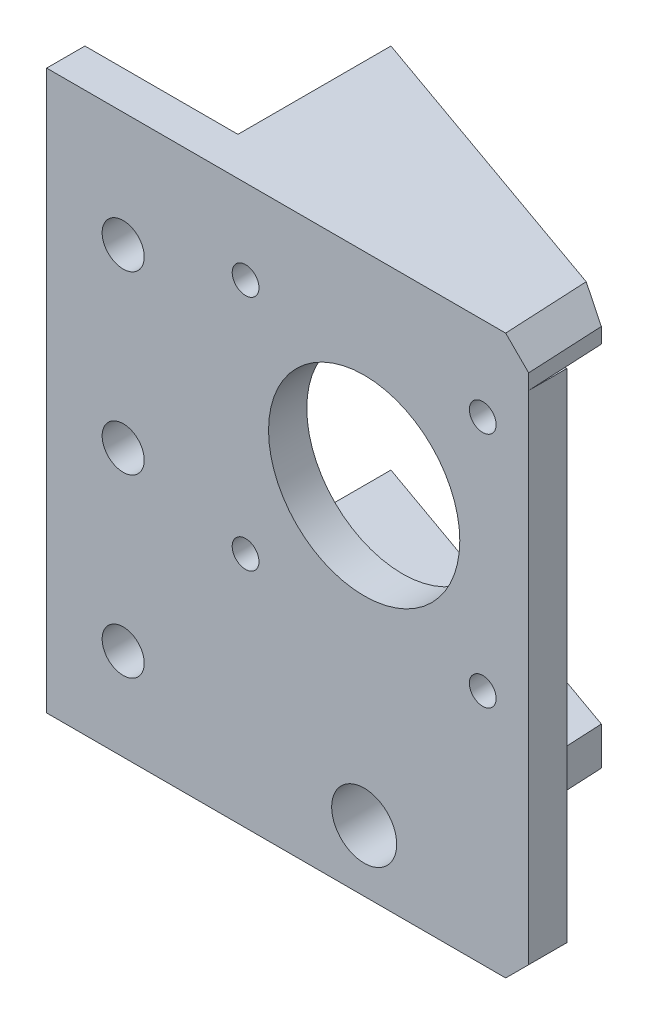
ISO-10303-21;
HEADER;
FILE_DESCRIPTION(('STEP AP214'),'2;1');
FILE_NAME('part.step','',(''),(''),'','','');
FILE_SCHEMA(('AUTOMOTIVE_DESIGN { 1 0 10303 214 1 1 1 1 }'));
ENDSEC;
DATA;
#1=APPLICATION_CONTEXT('core data for automotive mechanical design processes');
#2=APPLICATION_PROTOCOL_DEFINITION('international standard','automotive_design',2000,#1);
#3=PRODUCT_CONTEXT('',#1,'mechanical');
#4=PRODUCT('Part','Part','',(#3));
#5=PRODUCT_RELATED_PRODUCT_CATEGORY('part','',(#4));
#6=PRODUCT_DEFINITION_FORMATION('','',#4);
#7=PRODUCT_DEFINITION_CONTEXT('part definition',#1,'design');
#8=PRODUCT_DEFINITION('design','',#6,#7);
#9=PRODUCT_DEFINITION_SHAPE('','',#8);
#10=(LENGTH_UNIT() NAMED_UNIT(*) SI_UNIT(.MILLI.,.METRE.));
#11=(NAMED_UNIT(*) PLANE_ANGLE_UNIT() SI_UNIT($,.RADIAN.));
#12=(NAMED_UNIT(*) SI_UNIT($,.STERADIAN.) SOLID_ANGLE_UNIT());
#13=UNCERTAINTY_MEASURE_WITH_UNIT(LENGTH_MEASURE(1.E-05),#10,'distance_accuracy_value','');
#14=(GEOMETRIC_REPRESENTATION_CONTEXT(3) GLOBAL_UNCERTAINTY_ASSIGNED_CONTEXT((#13)) GLOBAL_UNIT_ASSIGNED_CONTEXT((#10,
#11,#12)) REPRESENTATION_CONTEXT('',''));
#15=CARTESIAN_POINT('',(0.,0.,0.));
#16=DIRECTION('',(0.,0.,1.));
#17=DIRECTION('',(1.,0.,0.));
#18=AXIS2_PLACEMENT_3D('',#15,#16,#17);
#19=CARTESIAN_POINT('',(63.027972027972,16.9685314685315,-20.));
#20=DIRECTION('',(1.,0.,0.));
#21=DIRECTION('',(0.,0.,1.));
#22=AXIS2_PLACEMENT_3D('',#19,#20,#21);
#23=PLANE('',#22);
#24=DIRECTION('',(0.,-1.,0.));
#25=VECTOR('',#24,1.);
#26=CARTESIAN_POINT('',(63.027972027972,16.9685314685315,0.));
#27=LINE('',#26,#25);
#28=CARTESIAN_POINT('',(63.027972027972,16.9685314685315,0.));
#29=VERTEX_POINT('',#28);
#30=CARTESIAN_POINT('',(63.027972027972,11.9685314685315,0.));
#31=VERTEX_POINT('',#30);
#32=EDGE_CURVE('E147',#29,#31,#27,.T.);
#33=ORIENTED_EDGE('',*,*,#32,.F.);
#34=DIRECTION('',(0.,0.,-1.));
#35=VECTOR('',#34,1.);
#36=CARTESIAN_POINT('',(63.027972027972,16.9685314685315,-20.));
#37=LINE('',#36,#35);
#38=CARTESIAN_POINT('',(63.027972027972,16.9685314685315,-20.));
#39=VERTEX_POINT('',#38);
#40=EDGE_CURVE('E165',#29,#39,#37,.T.);
#41=ORIENTED_EDGE('',*,*,#40,.T.);
#42=DIRECTION('',(0.,-1.,0.));
#43=VECTOR('',#42,1.);
#44=CARTESIAN_POINT('',(63.027972027972,16.9685314685315,-20.));
#45=LINE('',#44,#43);
#46=CARTESIAN_POINT('',(63.027972027972,11.9685314685315,-20.));
#47=VERTEX_POINT('',#46);
#48=EDGE_CURVE('E189',#39,#47,#45,.T.);
#49=ORIENTED_EDGE('',*,*,#48,.T.);
#50=DIRECTION('',(0.,0.,-1.));
#51=VECTOR('',#50,1.);
#52=CARTESIAN_POINT('',(63.027972027972,11.9685314685315,-20.));
#53=LINE('',#52,#51);
#54=EDGE_CURVE('E181',#31,#47,#53,.T.);
#55=ORIENTED_EDGE('',*,*,#54,.F.);
#56=EDGE_LOOP('',(#33,#41,#49,#55));
#57=FACE_BOUND('',#56,.T.);
#58=ADVANCED_FACE('F38',(#57),#23,.F.);
#59=CARTESIAN_POINT('',(106.027972027972,11.9685314685315,5.));
#60=DIRECTION('',(0.,-1.,0.));
#61=DIRECTION('',(0.,0.,-1.));
#62=AXIS2_PLACEMENT_3D('',#59,#60,#61);
#63=PLANE('',#62);
#64=DIRECTION('',(0.0499376169439517,0.,0.998752338877842));
#65=VECTOR('',#64,1.);
#66=CARTESIAN_POINT('',(106.027972027972,11.9685314685315,5.));
#67=LINE('',#66,#65);
#68=CARTESIAN_POINT('',(105.777972027972,11.9685314685315,0.));
#69=VERTEX_POINT('',#68);
#70=CARTESIAN_POINT('',(106.027972027972,11.9685314685315,5.));
#71=VERTEX_POINT('',#70);
#72=EDGE_CURVE('E173',#69,#71,#67,.T.);
#73=ORIENTED_EDGE('',*,*,#72,.T.);
#74=DIRECTION('',(0.,0.,-1.));
#75=VECTOR('',#74,1.);
#76=CARTESIAN_POINT('',(106.027972027972,11.9685314685315,5.));
#77=LINE('',#76,#75);
#78=CARTESIAN_POINT('',(106.027972027972,11.9685314685315,0.));
#79=VERTEX_POINT('',#78);
#80=EDGE_CURVE('E156',#71,#79,#77,.T.);
#81=ORIENTED_EDGE('',*,*,#80,.T.);
#82=DIRECTION('',(1.,0.,0.));
#83=VECTOR('',#82,1.);
#84=CARTESIAN_POINT('',(106.027972027972,11.9685314685315,0.));
#85=LINE('',#84,#83);
#86=EDGE_CURVE('E256',#69,#79,#85,.T.);
#87=ORIENTED_EDGE('',*,*,#86,.F.);
#88=EDGE_LOOP('',(#73,#81,#87));
#89=FACE_BOUND('',#88,.T.);
#90=ADVANCED_FACE('F287',(#89),#63,.F.);
#91=CARTESIAN_POINT('',(86.0559440559441,0.,0.));
#92=DIRECTION('',(0.,0.,1.));
#93=DIRECTION('',(-1.,0.,0.));
#94=AXIS2_PLACEMENT_3D('',#91,#92,#93);
#95=PLANE('',#94);
#96=CARTESIAN_POINT('',(53.027972027972,-44.0314685314685,0.));
#97=DIRECTION('',(0.,0.,-1.));
#98=DIRECTION('',(-1.,0.,0.));
#99=AXIS2_PLACEMENT_3D('',#96,#97,#98);
#100=CIRCLE('',#99,2.75);
#101=CARTESIAN_POINT('',(50.277972027972,-44.0314685314685,0.));
#102=VERTEX_POINT('',#101);
#103=EDGE_CURVE('E303',#102,#102,#100,.T.);
#104=ORIENTED_EDGE('',*,*,#103,.F.);
#105=EDGE_LOOP('',(#104));
#106=FACE_BOUND('',#105,.T.);
#107=DIRECTION('',(0.,1.,0.));
#108=VECTOR('',#107,1.);
#109=CARTESIAN_POINT('',(105.777972027972,-36.0314685314685,0.));
#110=LINE('',#109,#108);
#111=CARTESIAN_POINT('',(105.777972027972,-36.0314685314685,0.));
#112=VERTEX_POINT('',#111);
#113=CARTESIAN_POINT('',(105.777972027972,-31.0314685314685,0.));
#114=VERTEX_POINT('',#113);
#115=EDGE_CURVE('E331',#112,#114,#110,.T.);
#116=ORIENTED_EDGE('',*,*,#115,.T.);
#117=DIRECTION('',(1.,0.,0.));
#118=VECTOR('',#117,1.);
#119=CARTESIAN_POINT('',(63.027972027972,-31.0314685314685,0.));
#120=LINE('',#119,#118);
#121=CARTESIAN_POINT('',(63.027972027972,-31.0314685314685,0.));
#122=VERTEX_POINT('',#121);
#123=EDGE_CURVE('E325',#122,#114,#120,.T.);
#124=ORIENTED_EDGE('',*,*,#123,.F.);
#125=DIRECTION('',(0.,1.,0.));
#126=VECTOR('',#125,1.);
#127=CARTESIAN_POINT('',(63.027972027972,-36.0314685314685,0.));
#128=LINE('',#127,#126);
#129=CARTESIAN_POINT('',(63.027972027972,-36.0314685314685,0.));
#130=VERTEX_POINT('',#129);
#131=EDGE_CURVE('E333',#130,#122,#128,.T.);
#132=ORIENTED_EDGE('',*,*,#131,.F.);
#133=DIRECTION('',(1.,0.,0.));
#134=VECTOR('',#133,1.);
#135=CARTESIAN_POINT('',(63.027972027972,-36.0314685314685,0.));
#136=LINE('',#135,#134);
#137=EDGE_CURVE('E315',#130,#112,#136,.T.);
#138=ORIENTED_EDGE('',*,*,#137,.T.);
#139=EDGE_LOOP('',(#116,#124,#132,#138));
#140=FACE_BOUND('',#139,.T.);
#141=CARTESIAN_POINT('',(53.027972027972,-21.0314685314685,0.));
#142=DIRECTION('',(0.,0.,-1.));
#143=DIRECTION('',(-1.,0.,0.));
#144=AXIS2_PLACEMENT_3D('',#141,#142,#143);
#145=CIRCLE('',#144,2.75);
#146=CARTESIAN_POINT('',(50.277972027972,-21.0314685314685,0.));
#147=VERTEX_POINT('',#146);
#148=EDGE_CURVE('E207',#147,#147,#145,.T.);
#149=ORIENTED_EDGE('',*,*,#148,.F.);
#150=EDGE_LOOP('',(#149));
#151=FACE_BOUND('',#150,.T.);
#152=CARTESIAN_POINT('',(53.027972027972,1.96853146853145,0.));
#153=DIRECTION('',(0.,0.,-1.));
#154=DIRECTION('',(-1.,0.,0.));
#155=AXIS2_PLACEMENT_3D('',#152,#153,#154);
#156=CIRCLE('',#155,2.75);
#157=CARTESIAN_POINT('',(50.277972027972,1.96853146853145,0.));
#158=VERTEX_POINT('',#157);
#159=EDGE_CURVE('E211',#158,#158,#156,.T.);
#160=ORIENTED_EDGE('',*,*,#159,.F.);
#161=EDGE_LOOP('',(#160));
#162=FACE_BOUND('',#161,.T.);
#163=CARTESIAN_POINT('',(84.527972027972,-9.53146853146854,0.));
#164=DIRECTION('',(0.,0.,-1.));
#165=DIRECTION('',(-1.,0.,0.));
#166=AXIS2_PLACEMENT_3D('',#163,#164,#165);
#167=CIRCLE('',#166,12.5);
#168=CARTESIAN_POINT('',(72.027972027972,-9.53146853146854,0.));
#169=VERTEX_POINT('',#168);
#170=EDGE_CURVE('E217',#169,#169,#167,.T.);
#171=ORIENTED_EDGE('',*,*,#170,.F.);
#172=EDGE_LOOP('',(#171));
#173=FACE_BOUND('',#172,.T.);
#174=CARTESIAN_POINT('',(100.027972027972,-25.0314685314685,0.));
#175=DIRECTION('',(0.,0.,-1.));
#176=DIRECTION('',(-1.,0.,0.));
#177=AXIS2_PLACEMENT_3D('',#174,#175,#176);
#178=CIRCLE('',#177,1.75);
#179=CARTESIAN_POINT('',(98.277972027972,-25.0314685314685,0.));
#180=VERTEX_POINT('',#179);
#181=EDGE_CURVE('E223',#180,#180,#178,.T.);
#182=ORIENTED_EDGE('',*,*,#181,.F.);
#183=EDGE_LOOP('',(#182));
#184=FACE_BOUND('',#183,.T.);
#185=CARTESIAN_POINT('',(69.027972027972,-25.0314685314685,0.));
#186=DIRECTION('',(0.,0.,-1.));
#187=DIRECTION('',(-1.,0.,0.));
#188=AXIS2_PLACEMENT_3D('',#185,#186,#187);
#189=CIRCLE('',#188,1.75);
#190=CARTESIAN_POINT('',(67.277972027972,-25.0314685314685,0.));
#191=VERTEX_POINT('',#190);
#192=EDGE_CURVE('E229',#191,#191,#189,.T.);
#193=ORIENTED_EDGE('',*,*,#192,.F.);
#194=EDGE_LOOP('',(#193));
#195=FACE_BOUND('',#194,.T.);
#196=CARTESIAN_POINT('',(69.027972027972,5.96853146853146,0.));
#197=DIRECTION('',(0.,0.,-1.));
#198=DIRECTION('',(-1.,0.,0.));
#199=AXIS2_PLACEMENT_3D('',#196,#197,#198);
#200=CIRCLE('',#199,1.75);
#201=CARTESIAN_POINT('',(67.277972027972,5.96853146853146,0.));
#202=VERTEX_POINT('',#201);
#203=EDGE_CURVE('E235',#202,#202,#200,.T.);
#204=ORIENTED_EDGE('',*,*,#203,.F.);
#205=EDGE_LOOP('',(#204));
#206=FACE_BOUND('',#205,.T.);
#207=CARTESIAN_POINT('',(100.027972027972,5.96853146853146,0.));
#208=DIRECTION('',(0.,0.,-1.));
#209=DIRECTION('',(-1.,0.,0.));
#210=AXIS2_PLACEMENT_3D('',#207,#208,#209);
#211=CIRCLE('',#210,1.75);
#212=CARTESIAN_POINT('',(98.277972027972,5.96853146853146,0.));
#213=VERTEX_POINT('',#212);
#214=EDGE_CURVE('E241',#213,#213,#211,.T.);
#215=ORIENTED_EDGE('',*,*,#214,.F.);
#216=EDGE_LOOP('',(#215));
#217=FACE_BOUND('',#216,.T.);
#218=DIRECTION('',(-1.,0.,0.));
#219=VECTOR('',#218,1.);
#220=CARTESIAN_POINT('',(106.027972027972,-56.0314685314685,0.));
#221=LINE('',#220,#219);
#222=CARTESIAN_POINT('',(103.027972027972,-56.0314685314685,0.));
#223=VERTEX_POINT('',#222);
#224=CARTESIAN_POINT('',(43.027972027972,-56.0314685314685,0.));
#225=VERTEX_POINT('',#224);
#226=EDGE_CURVE('E201',#223,#225,#221,.T.);
#227=ORIENTED_EDGE('',*,*,#226,.T.);
#228=DIRECTION('',(0.,1.,0.));
#229=VECTOR('',#228,1.);
#230=CARTESIAN_POINT('',(43.027972027972,11.9685314685315,0.));
#231=LINE('',#230,#229);
#232=CARTESIAN_POINT('',(43.027972027972,16.9685314685315,0.));
#233=VERTEX_POINT('',#232);
#234=EDGE_CURVE('E254',#225,#233,#231,.T.);
#235=ORIENTED_EDGE('',*,*,#234,.T.);
#236=DIRECTION('',(1.,0.,0.));
#237=VECTOR('',#236,1.);
#238=CARTESIAN_POINT('',(43.027972027972,16.9685314685315,0.));
#239=LINE('',#238,#237);
#240=EDGE_CURVE('E143',#233,#29,#239,.T.);
#241=ORIENTED_EDGE('',*,*,#240,.T.);
#242=ORIENTED_EDGE('',*,*,#32,.T.);
#243=EDGE_CURVE('E250',#31,#69,#85,.T.);
#244=ORIENTED_EDGE('',*,*,#243,.T.);
#245=ORIENTED_EDGE('',*,*,#86,.T.);
#246=DIRECTION('',(0.,-1.,0.));
#247=VECTOR('',#246,1.);
#248=CARTESIAN_POINT('',(106.027972027972,11.9685314685315,0.));
#249=LINE('',#248,#247);
#250=CARTESIAN_POINT('',(106.027972027972,-53.0314685314685,0.));
#251=VERTEX_POINT('',#250);
#252=EDGE_CURVE('E247',#79,#251,#249,.T.);
#253=ORIENTED_EDGE('',*,*,#252,.T.);
#254=DIRECTION('',(0.707106781186547,0.707106781186548,0.));
#255=VECTOR('',#254,1.);
#256=CARTESIAN_POINT('',(103.027972027972,-56.0314685314685,0.));
#257=LINE('',#256,#255);
#258=EDGE_CURVE('E46',#223,#251,#257,.T.);
#259=ORIENTED_EDGE('',*,*,#258,.F.);
#260=EDGE_LOOP('',(#227,#235,#241,#242,#244,#245,#253,#259));
#261=FACE_BOUND('',#260,.T.);
#262=CARTESIAN_POINT('',(84.527972027972,-48.0314685314685,0.));
#263=DIRECTION('',(0.,0.,-1.));
#264=DIRECTION('',(-1.,0.,0.));
#265=AXIS2_PLACEMENT_3D('',#262,#263,#264);
#266=CIRCLE('',#265,7.75);
#267=CARTESIAN_POINT('',(76.777972027972,-48.0314685314685,0.));
#268=VERTEX_POINT('',#267);
#269=EDGE_CURVE('E261',#268,#268,#266,.F.);
#270=ORIENTED_EDGE('',*,*,#269,.T.);
#271=EDGE_LOOP('',(#270));
#272=FACE_BOUND('',#271,.T.);
#273=ADVANCED_FACE('F276',(#106,#140,#151,#162,#173,#184,#195,#206,#217,#261,#272),#95,.F.);
#274=CARTESIAN_POINT('',(86.0559440559441,0.,5.));
#275=DIRECTION('',(0.,0.,1.));
#276=DIRECTION('',(-1.,0.,0.));
#277=AXIS2_PLACEMENT_3D('',#274,#275,#276);
#278=PLANE('',#277);
#279=CARTESIAN_POINT('',(53.027972027972,-44.0314685314685,5.));
#280=DIRECTION('',(0.,0.,-1.));
#281=DIRECTION('',(-1.,0.,0.));
#282=AXIS2_PLACEMENT_3D('',#279,#280,#281);
#283=CIRCLE('',#282,2.75);
#284=CARTESIAN_POINT('',(50.277972027972,-44.0314685314685,5.));
#285=VERTEX_POINT('',#284);
#286=EDGE_CURVE('E300',#285,#285,#283,.T.);
#287=ORIENTED_EDGE('',*,*,#286,.T.);
#288=EDGE_LOOP('',(#287));
#289=FACE_BOUND('',#288,.T.);
#290=CARTESIAN_POINT('',(84.527972027972,-48.0314685314685,5.));
#291=DIRECTION('',(0.,0.,-1.));
#292=DIRECTION('',(-1.,0.,0.));
#293=AXIS2_PLACEMENT_3D('',#290,#291,#292);
#294=CIRCLE('',#293,4.25);
#295=CARTESIAN_POINT('',(80.277972027972,-48.0314685314685,5.));
#296=VERTEX_POINT('',#295);
#297=EDGE_CURVE('E198',#296,#296,#294,.T.);
#298=ORIENTED_EDGE('',*,*,#297,.T.);
#299=EDGE_LOOP('',(#298));
#300=FACE_BOUND('',#299,.T.);
#301=CARTESIAN_POINT('',(53.027972027972,1.96853146853145,5.));
#302=DIRECTION('',(0.,0.,-1.));
#303=DIRECTION('',(-1.,0.,0.));
#304=AXIS2_PLACEMENT_3D('',#301,#302,#303);
#305=CIRCLE('',#304,2.75);
#306=CARTESIAN_POINT('',(50.277972027972,1.96853146853145,5.));
#307=VERTEX_POINT('',#306);
#308=EDGE_CURVE('E214',#307,#307,#305,.T.);
#309=ORIENTED_EDGE('',*,*,#308,.T.);
#310=EDGE_LOOP('',(#309));
#311=FACE_BOUND('',#310,.T.);
#312=CARTESIAN_POINT('',(100.027972027972,-25.0314685314685,5.));
#313=DIRECTION('',(0.,0.,-1.));
#314=DIRECTION('',(-1.,0.,0.));
#315=AXIS2_PLACEMENT_3D('',#312,#313,#314);
#316=CIRCLE('',#315,1.75);
#317=CARTESIAN_POINT('',(98.277972027972,-25.0314685314685,5.));
#318=VERTEX_POINT('',#317);
#319=EDGE_CURVE('E226',#318,#318,#316,.T.);
#320=ORIENTED_EDGE('',*,*,#319,.T.);
#321=EDGE_LOOP('',(#320));
#322=FACE_BOUND('',#321,.T.);
#323=CARTESIAN_POINT('',(69.027972027972,5.96853146853146,5.));
#324=DIRECTION('',(0.,0.,-1.));
#325=DIRECTION('',(-1.,0.,0.));
#326=AXIS2_PLACEMENT_3D('',#323,#324,#325);
#327=CIRCLE('',#326,1.75);
#328=CARTESIAN_POINT('',(67.277972027972,5.96853146853146,5.));
#329=VERTEX_POINT('',#328);
#330=EDGE_CURVE('E238',#329,#329,#327,.T.);
#331=ORIENTED_EDGE('',*,*,#330,.T.);
#332=EDGE_LOOP('',(#331));
#333=FACE_BOUND('',#332,.T.);
#334=DIRECTION('',(-1.,0.,0.));
#335=VECTOR('',#334,1.);
#336=CARTESIAN_POINT('',(63.027972027972,16.9685314685315,5.));
#337=LINE('',#336,#335);
#338=CARTESIAN_POINT('',(103.024224368797,16.9685314685315,5.));
#339=VERTEX_POINT('',#338);
#340=CARTESIAN_POINT('',(43.027972027972,16.9685314685315,5.));
#341=VERTEX_POINT('',#340);
#342=EDGE_CURVE('E141',#339,#341,#337,.T.);
#343=ORIENTED_EDGE('',*,*,#342,.T.);
#344=DIRECTION('',(0.,1.,0.));
#345=VECTOR('',#344,1.);
#346=CARTESIAN_POINT('',(43.027972027972,11.9685314685315,5.));
#347=LINE('',#346,#345);
#348=CARTESIAN_POINT('',(43.027972027972,-56.0314685314685,5.));
#349=VERTEX_POINT('',#348);
#350=EDGE_CURVE('E150',#349,#341,#347,.T.);
#351=ORIENTED_EDGE('',*,*,#350,.F.);
#352=DIRECTION('',(1.,0.,0.));
#353=VECTOR('',#352,1.);
#354=CARTESIAN_POINT('',(43.027972027972,-56.0314685314685,5.));
#355=LINE('',#354,#353);
#356=CARTESIAN_POINT('',(103.027972027972,-56.0314685314685,5.));
#357=VERTEX_POINT('',#356);
#358=EDGE_CURVE('E205',#349,#357,#355,.T.);
#359=ORIENTED_EDGE('',*,*,#358,.T.);
#360=DIRECTION('',(-0.707106781186547,-0.707106781186548,0.));
#361=VECTOR('',#360,1.);
#362=CARTESIAN_POINT('',(122.557692307692,-36.5017482517482,5.));
#363=LINE('',#362,#361);
#364=CARTESIAN_POINT('',(106.027972027972,-53.0314685314685,5.));
#365=VERTEX_POINT('',#364);
#366=EDGE_CURVE('E266',#365,#357,#363,.T.);
#367=ORIENTED_EDGE('',*,*,#366,.F.);
#368=DIRECTION('',(0.,-1.,0.));
#369=VECTOR('',#368,1.);
#370=CARTESIAN_POINT('',(106.027972027972,11.9685314685315,5.));
#371=LINE('',#370,#369);
#372=EDGE_CURVE('E157',#71,#365,#371,.T.);
#373=ORIENTED_EDGE('',*,*,#372,.F.);
#374=DIRECTION('',(0.,-1.,0.));
#375=VECTOR('',#374,1.);
#376=CARTESIAN_POINT('',(106.027972027972,16.9685314685315,5.));
#377=LINE('',#376,#375);
#378=CARTESIAN_POINT('',(106.027972027972,13.9685314685315,5.));
#379=VERTEX_POINT('',#378);
#380=EDGE_CURVE('E180',#379,#71,#377,.T.);
#381=ORIENTED_EDGE('',*,*,#380,.F.);
#382=DIRECTION('',(0.707548033511042,-0.706665253337574,0.));
#383=VECTOR('',#382,1.);
#384=CARTESIAN_POINT('',(103.013751399564,16.9789913710474,5.));
#385=LINE('',#384,#383);
#386=EDGE_CURVE('E164',#339,#379,#385,.T.);
#387=ORIENTED_EDGE('',*,*,#386,.F.);
#388=EDGE_LOOP('',(#343,#351,#359,#367,#373,#381,#387));
#389=FACE_BOUND('',#388,.T.);
#390=CARTESIAN_POINT('',(100.027972027972,5.96853146853146,5.));
#391=DIRECTION('',(0.,0.,-1.));
#392=DIRECTION('',(-1.,0.,0.));
#393=AXIS2_PLACEMENT_3D('',#390,#391,#392);
#394=CIRCLE('',#393,1.75);
#395=CARTESIAN_POINT('',(98.277972027972,5.96853146853146,5.));
#396=VERTEX_POINT('',#395);
#397=EDGE_CURVE('E244',#396,#396,#394,.T.);
#398=ORIENTED_EDGE('',*,*,#397,.T.);
#399=EDGE_LOOP('',(#398));
#400=FACE_BOUND('',#399,.T.);
#401=CARTESIAN_POINT('',(69.027972027972,-25.0314685314685,5.));
#402=DIRECTION('',(0.,0.,-1.));
#403=DIRECTION('',(-1.,0.,0.));
#404=AXIS2_PLACEMENT_3D('',#401,#402,#403);
#405=CIRCLE('',#404,1.75);
#406=CARTESIAN_POINT('',(67.277972027972,-25.0314685314685,5.));
#407=VERTEX_POINT('',#406);
#408=EDGE_CURVE('E232',#407,#407,#405,.T.);
#409=ORIENTED_EDGE('',*,*,#408,.T.);
#410=EDGE_LOOP('',(#409));
#411=FACE_BOUND('',#410,.T.);
#412=CARTESIAN_POINT('',(84.527972027972,-9.53146853146854,5.));
#413=DIRECTION('',(0.,0.,-1.));
#414=DIRECTION('',(-1.,0.,0.));
#415=AXIS2_PLACEMENT_3D('',#412,#413,#414);
#416=CIRCLE('',#415,12.5);
#417=CARTESIAN_POINT('',(72.027972027972,-9.53146853146854,5.));
#418=VERTEX_POINT('',#417);
#419=EDGE_CURVE('E220',#418,#418,#416,.T.);
#420=ORIENTED_EDGE('',*,*,#419,.T.);
#421=EDGE_LOOP('',(#420));
#422=FACE_BOUND('',#421,.T.);
#423=CARTESIAN_POINT('',(53.027972027972,-21.0314685314685,5.));
#424=DIRECTION('',(0.,0.,-1.));
#425=DIRECTION('',(-1.,0.,0.));
#426=AXIS2_PLACEMENT_3D('',#423,#424,#425);
#427=CIRCLE('',#426,2.75);
#428=CARTESIAN_POINT('',(50.277972027972,-21.0314685314685,5.));
#429=VERTEX_POINT('',#428);
#430=EDGE_CURVE('E208',#429,#429,#427,.T.);
#431=ORIENTED_EDGE('',*,*,#430,.T.);
#432=EDGE_LOOP('',(#431));
#433=FACE_BOUND('',#432,.T.);
#434=ADVANCED_FACE('F160',(#289,#300,#311,#322,#333,#389,#400,#411,#422,#433),#278,.T.);
#435=CARTESIAN_POINT('',(106.027972027972,11.9685314685315,5.));
#436=DIRECTION('',(-1.,0.,0.));
#437=DIRECTION('',(0.,1.,0.));
#438=AXIS2_PLACEMENT_3D('',#435,#436,#437);
#439=PLANE('',#438);
#440=ORIENTED_EDGE('',*,*,#252,.F.);
#441=ORIENTED_EDGE('',*,*,#80,.F.);
#442=ORIENTED_EDGE('',*,*,#372,.T.);
#443=DIRECTION('',(0.,0.,1.));
#444=VECTOR('',#443,1.);
#445=CARTESIAN_POINT('',(106.027972027972,-53.0314685314685,5.));
#446=LINE('',#445,#444);
#447=EDGE_CURVE('E11',#251,#365,#446,.T.);
#448=ORIENTED_EDGE('',*,*,#447,.F.);
#449=EDGE_LOOP('',(#440,#441,#442,#448));
#450=FACE_BOUND('',#449,.T.);
#451=ADVANCED_FACE('F281',(#450),#439,.F.);
#452=CARTESIAN_POINT('',(43.027972027972,11.9685314685315,5.));
#453=DIRECTION('',(1.,0.,0.));
#454=DIRECTION('',(0.,0.,1.));
#455=AXIS2_PLACEMENT_3D('',#452,#453,#454);
#456=PLANE('',#455);
#457=ORIENTED_EDGE('',*,*,#234,.F.);
#458=DIRECTION('',(0.,0.,1.));
#459=VECTOR('',#458,1.);
#460=CARTESIAN_POINT('',(43.027972027972,-56.0314685314685,0.));
#461=LINE('',#460,#459);
#462=EDGE_CURVE('E152',#225,#349,#461,.T.);
#463=ORIENTED_EDGE('',*,*,#462,.T.);
#464=ORIENTED_EDGE('',*,*,#350,.T.);
#465=DIRECTION('',(0.,0.,-1.));
#466=VECTOR('',#465,1.);
#467=CARTESIAN_POINT('',(43.027972027972,16.9685314685315,5.));
#468=LINE('',#467,#466);
#469=EDGE_CURVE('E137',#341,#233,#468,.T.);
#470=ORIENTED_EDGE('',*,*,#469,.T.);
#471=EDGE_LOOP('',(#457,#463,#464,#470));
#472=FACE_BOUND('',#471,.T.);
#473=ADVANCED_FACE('F151',(#472),#456,.F.);
#474=CARTESIAN_POINT('',(100.027972027972,5.96853146853146,5.));
#475=DIRECTION('',(0.,0.,-1.));
#476=DIRECTION('',(1.,0.,0.));
#477=AXIS2_PLACEMENT_3D('',#474,#475,#476);
#478=CYLINDRICAL_SURFACE('',#477,1.75);
#479=ORIENTED_EDGE('',*,*,#397,.F.);
#480=EDGE_LOOP('',(#479));
#481=FACE_BOUND('',#480,.T.);
#482=ORIENTED_EDGE('',*,*,#214,.T.);
#483=EDGE_LOOP('',(#482));
#484=FACE_BOUND('',#483,.T.);
#485=ADVANCED_FACE('F410',(#481,#484),#478,.F.);
#486=CARTESIAN_POINT('',(69.027972027972,5.96853146853146,5.));
#487=DIRECTION('',(0.,0.,-1.));
#488=DIRECTION('',(1.,0.,0.));
#489=AXIS2_PLACEMENT_3D('',#486,#487,#488);
#490=CYLINDRICAL_SURFACE('',#489,1.75);
#491=ORIENTED_EDGE('',*,*,#330,.F.);
#492=EDGE_LOOP('',(#491));
#493=FACE_BOUND('',#492,.T.);
#494=ORIENTED_EDGE('',*,*,#203,.T.);
#495=EDGE_LOOP('',(#494));
#496=FACE_BOUND('',#495,.T.);
#497=ADVANCED_FACE('F406',(#493,#496),#490,.F.);
#498=CARTESIAN_POINT('',(69.027972027972,-25.0314685314685,5.));
#499=DIRECTION('',(0.,0.,-1.));
#500=DIRECTION('',(1.,0.,0.));
#501=AXIS2_PLACEMENT_3D('',#498,#499,#500);
#502=CYLINDRICAL_SURFACE('',#501,1.75);
#503=ORIENTED_EDGE('',*,*,#408,.F.);
#504=EDGE_LOOP('',(#503));
#505=FACE_BOUND('',#504,.T.);
#506=ORIENTED_EDGE('',*,*,#192,.T.);
#507=EDGE_LOOP('',(#506));
#508=FACE_BOUND('',#507,.T.);
#509=ADVANCED_FACE('F402',(#505,#508),#502,.F.);
#510=CARTESIAN_POINT('',(100.027972027972,-25.0314685314685,5.));
#511=DIRECTION('',(0.,0.,-1.));
#512=DIRECTION('',(1.,0.,0.));
#513=AXIS2_PLACEMENT_3D('',#510,#511,#512);
#514=CYLINDRICAL_SURFACE('',#513,1.75);
#515=ORIENTED_EDGE('',*,*,#319,.F.);
#516=EDGE_LOOP('',(#515));
#517=FACE_BOUND('',#516,.T.);
#518=ORIENTED_EDGE('',*,*,#181,.T.);
#519=EDGE_LOOP('',(#518));
#520=FACE_BOUND('',#519,.T.);
#521=ADVANCED_FACE('F398',(#517,#520),#514,.F.);
#522=CARTESIAN_POINT('',(84.527972027972,-9.53146853146854,5.));
#523=DIRECTION('',(0.,0.,-1.));
#524=DIRECTION('',(1.,0.,0.));
#525=AXIS2_PLACEMENT_3D('',#522,#523,#524);
#526=CYLINDRICAL_SURFACE('',#525,12.5);
#527=ORIENTED_EDGE('',*,*,#419,.F.);
#528=EDGE_LOOP('',(#527));
#529=FACE_BOUND('',#528,.T.);
#530=ORIENTED_EDGE('',*,*,#170,.T.);
#531=EDGE_LOOP('',(#530));
#532=FACE_BOUND('',#531,.T.);
#533=ADVANCED_FACE('F394',(#529,#532),#526,.F.);
#534=CARTESIAN_POINT('',(53.027972027972,1.96853146853145,5.));
#535=DIRECTION('',(0.,0.,-1.));
#536=DIRECTION('',(1.,0.,0.));
#537=AXIS2_PLACEMENT_3D('',#534,#535,#536);
#538=CYLINDRICAL_SURFACE('',#537,2.75);
#539=ORIENTED_EDGE('',*,*,#308,.F.);
#540=EDGE_LOOP('',(#539));
#541=FACE_BOUND('',#540,.T.);
#542=ORIENTED_EDGE('',*,*,#159,.T.);
#543=EDGE_LOOP('',(#542));
#544=FACE_BOUND('',#543,.T.);
#545=ADVANCED_FACE('F390',(#541,#544),#538,.F.);
#546=CARTESIAN_POINT('',(53.027972027972,-21.0314685314685,5.));
#547=DIRECTION('',(0.,0.,-1.));
#548=DIRECTION('',(1.,0.,0.));
#549=AXIS2_PLACEMENT_3D('',#546,#547,#548);
#550=CYLINDRICAL_SURFACE('',#549,2.75);
#551=ORIENTED_EDGE('',*,*,#430,.F.);
#552=EDGE_LOOP('',(#551));
#553=FACE_BOUND('',#552,.T.);
#554=ORIENTED_EDGE('',*,*,#148,.T.);
#555=EDGE_LOOP('',(#554));
#556=FACE_BOUND('',#555,.T.);
#557=ADVANCED_FACE('F387',(#553,#556),#550,.F.);
#558=CARTESIAN_POINT('',(86.0559440559441,-56.0314685314685,0.));
#559=DIRECTION('',(0.,-1.,0.));
#560=DIRECTION('',(0.,0.,-1.));
#561=AXIS2_PLACEMENT_3D('',#558,#559,#560);
#562=PLANE('',#561);
#563=ORIENTED_EDGE('',*,*,#358,.F.);
#564=ORIENTED_EDGE('',*,*,#462,.F.);
#565=ORIENTED_EDGE('',*,*,#226,.F.);
#566=DIRECTION('',(0.,0.,-1.));
#567=VECTOR('',#566,1.);
#568=CARTESIAN_POINT('',(103.027972027972,-56.0314685314685,0.));
#569=LINE('',#568,#567);
#570=EDGE_CURVE('E58',#357,#223,#569,.T.);
#571=ORIENTED_EDGE('',*,*,#570,.F.);
#572=EDGE_LOOP('',(#563,#564,#565,#571));
#573=FACE_BOUND('',#572,.T.);
#574=ADVANCED_FACE('F293',(#573),#562,.T.);
#575=CARTESIAN_POINT('',(84.527972027972,-48.0314685314685,-20.));
#576=DIRECTION('',(0.,0.,1.));
#577=DIRECTION('',(-1.,0.,0.));
#578=AXIS2_PLACEMENT_3D('',#575,#576,#577);
#579=CYLINDRICAL_SURFACE('',#578,4.25);
#580=ORIENTED_EDGE('',*,*,#297,.F.);
#581=EDGE_LOOP('',(#580));
#582=FACE_BOUND('',#581,.T.);
#583=CARTESIAN_POINT('',(84.527972027972,-48.0314685314685,-10.));
#584=DIRECTION('',(0.,0.,1.));
#585=DIRECTION('',(1.,0.,0.));
#586=AXIS2_PLACEMENT_3D('',#583,#584,#585);
#587=CIRCLE('',#586,4.25);
#588=CARTESIAN_POINT('',(88.777972027972,-48.0314685314685,-10.));
#589=VERTEX_POINT('',#588);
#590=EDGE_CURVE('E192',#589,#589,#587,.T.);
#591=ORIENTED_EDGE('',*,*,#590,.F.);
#592=EDGE_LOOP('',(#591));
#593=FACE_BOUND('',#592,.T.);
#594=ADVANCED_FACE('F376',(#582,#593),#579,.F.);
#595=CARTESIAN_POINT('',(84.527972027972,-48.0314685314685,-10.));
#596=DIRECTION('',(0.,0.,-1.));
#597=DIRECTION('',(1.,0.,0.));
#598=AXIS2_PLACEMENT_3D('',#595,#596,#597);
#599=PLANE('',#598);
#600=CARTESIAN_POINT('',(84.527972027972,-48.0314685314685,-10.));
#601=DIRECTION('',(0.,0.,1.));
#602=DIRECTION('',(1.,0.,0.));
#603=AXIS2_PLACEMENT_3D('',#600,#601,#602);
#604=CIRCLE('',#603,7.75);
#605=CARTESIAN_POINT('',(92.277972027972,-48.0314685314685,-10.));
#606=VERTEX_POINT('',#605);
#607=EDGE_CURVE('E195',#606,#606,#604,.T.);
#608=ORIENTED_EDGE('',*,*,#607,.F.);
#609=EDGE_LOOP('',(#608));
#610=FACE_BOUND('',#609,.T.);
#611=ORIENTED_EDGE('',*,*,#590,.T.);
#612=EDGE_LOOP('',(#611));
#613=FACE_BOUND('',#612,.T.);
#614=ADVANCED_FACE('F372',(#610,#613),#599,.T.);
#615=CARTESIAN_POINT('',(84.527972027972,-48.0314685314685,-10.));
#616=DIRECTION('',(0.,0.,1.));
#617=DIRECTION('',(-1.,0.,0.));
#618=AXIS2_PLACEMENT_3D('',#615,#616,#617);
#619=CYLINDRICAL_SURFACE('',#618,7.75);
#620=ORIENTED_EDGE('',*,*,#607,.T.);
#621=EDGE_LOOP('',(#620));
#622=FACE_BOUND('',#621,.T.);
#623=ORIENTED_EDGE('',*,*,#269,.F.);
#624=EDGE_LOOP('',(#623));
#625=FACE_BOUND('',#624,.T.);
#626=ADVANCED_FACE('F375',(#622,#625),#619,.T.);
#627=CARTESIAN_POINT('',(86.0559440559441,11.9685314685315,0.));
#628=DIRECTION('',(0.,1.,0.));
#629=DIRECTION('',(0.,0.,1.));
#630=AXIS2_PLACEMENT_3D('',#627,#628,#629);
#631=PLANE('',#630);
#632=ORIENTED_EDGE('',*,*,#54,.T.);
#633=DIRECTION('',(0.942990333582888,0.,0.332820117735142));
#634=VECTOR('',#633,1.);
#635=CARTESIAN_POINT('',(105.527972027971,11.9685314685315,-5.));
#636=LINE('',#635,#634);
#637=CARTESIAN_POINT('',(105.527972027971,11.9685314685315,-5.));
#638=VERTEX_POINT('',#637);
#639=EDGE_CURVE('E171',#47,#638,#636,.T.);
#640=ORIENTED_EDGE('',*,*,#639,.T.);
#641=EDGE_CURVE('E166',#638,#69,#67,.T.);
#642=ORIENTED_EDGE('',*,*,#641,.T.);
#643=ORIENTED_EDGE('',*,*,#243,.F.);
#644=EDGE_LOOP('',(#632,#640,#642,#643));
#645=FACE_BOUND('',#644,.T.);
#646=ADVANCED_FACE('F380',(#645),#631,.F.);
#647=CARTESIAN_POINT('',(105.527972027971,16.9685314685315,-5.));
#648=DIRECTION('',(-0.332820117735142,0.,0.942990333582888));
#649=DIRECTION('',(-0.942990333582888,0.,-0.332820117735142));
#650=AXIS2_PLACEMENT_3D('',#647,#648,#649);
#651=PLANE('',#650);
#652=DIRECTION('',(0.,-1.,0.));
#653=VECTOR('',#652,1.);
#654=CARTESIAN_POINT('',(105.527972027971,16.9685314685315,-5.));
#655=LINE('',#654,#653);
#656=CARTESIAN_POINT('',(105.527972027971,13.9685314685315,-5.));
#657=VERTEX_POINT('',#656);
#658=EDGE_CURVE('E187',#657,#638,#655,.T.);
#659=ORIENTED_EDGE('',*,*,#658,.T.);
#660=ORIENTED_EDGE('',*,*,#639,.F.);
#661=ORIENTED_EDGE('',*,*,#48,.F.);
#662=DIRECTION('',(0.942990333582888,0.,0.332820117735142));
#663=VECTOR('',#662,1.);
#664=CARTESIAN_POINT('',(105.527972027971,16.9685314685315,-5.));
#665=LINE('',#664,#663);
#666=CARTESIAN_POINT('',(102.470264830009,16.9685314685315,-6.07919077575158));
#667=VERTEX_POINT('',#666);
#668=EDGE_CURVE('E169',#39,#667,#665,.T.);
#669=ORIENTED_EDGE('',*,*,#668,.T.);
#670=DIRECTION('',(-0.692181886166218,0.679118543424362,-0.244299489235139));
#671=VECTOR('',#670,1.);
#672=CARTESIAN_POINT('',(103.482910524593,15.9749971347743,-5.72178641295717));
#673=LINE('',#672,#671);
#674=EDGE_CURVE('E271',#657,#667,#673,.T.);
#675=ORIENTED_EDGE('',*,*,#674,.F.);
#676=EDGE_LOOP('',(#659,#660,#661,#669,#675));
#677=FACE_BOUND('',#676,.T.);
#678=ADVANCED_FACE('F370',(#677),#651,.F.);
#679=CARTESIAN_POINT('',(106.027972027972,16.9685314685315,5.));
#680=DIRECTION('',(-0.998752338877842,0.,0.0499376169439517));
#681=DIRECTION('',(-0.0499376169439517,0.,-0.998752338877842));
#682=AXIS2_PLACEMENT_3D('',#679,#680,#681);
#683=PLANE('',#682);
#684=ORIENTED_EDGE('',*,*,#380,.T.);
#685=ORIENTED_EDGE('',*,*,#72,.F.);
#686=ORIENTED_EDGE('',*,*,#641,.F.);
#687=ORIENTED_EDGE('',*,*,#658,.F.);
#688=DIRECTION('',(-0.0499376169439517,0.,-0.998752338877842));
#689=VECTOR('',#688,1.);
#690=CARTESIAN_POINT('',(105.527972027971,13.9685314685315,-5.));
#691=LINE('',#690,#689);
#692=EDGE_CURVE('E269',#379,#657,#691,.T.);
#693=ORIENTED_EDGE('',*,*,#692,.F.);
#694=EDGE_LOOP('',(#684,#685,#686,#687,#693));
#695=FACE_BOUND('',#694,.T.);
#696=ADVANCED_FACE('F290',(#695),#683,.F.);
#697=CARTESIAN_POINT('',(86.0559440559441,16.9685314685315,0.));
#698=DIRECTION('',(0.,1.,0.));
#699=DIRECTION('',(0.,0.,1.));
#700=AXIS2_PLACEMENT_3D('',#697,#698,#699);
#701=PLANE('',#700);
#702=ORIENTED_EDGE('',*,*,#668,.F.);
#703=ORIENTED_EDGE('',*,*,#40,.F.);
#704=ORIENTED_EDGE('',*,*,#240,.F.);
#705=ORIENTED_EDGE('',*,*,#469,.F.);
#706=ORIENTED_EDGE('',*,*,#342,.F.);
#707=DIRECTION('',(0.0499376169439517,0.,0.998752338877842));
#708=VECTOR('',#707,1.);
#709=CARTESIAN_POINT('',(103.031715011339,16.9685314685315,5.14981285083185));
#710=LINE('',#709,#708);
#711=EDGE_CURVE('E264',#667,#339,#710,.T.);
#712=ORIENTED_EDGE('',*,*,#711,.F.);
#713=EDGE_LOOP('',(#702,#703,#704,#705,#706,#712));
#714=FACE_BOUND('',#713,.T.);
#715=ADVANCED_FACE('F139',(#714),#701,.T.);
#716=CARTESIAN_POINT('',(105.527972027971,-36.0314685314685,-5.));
#717=DIRECTION('',(-0.332820117735142,0.,0.942990333582888));
#718=DIRECTION('',(-0.942990333582888,0.,-0.332820117735142));
#719=AXIS2_PLACEMENT_3D('',#716,#717,#718);
#720=PLANE('',#719);
#721=DIRECTION('',(-0.942990333582888,0.,-0.332820117735142));
#722=VECTOR('',#721,1.);
#723=CARTESIAN_POINT('',(105.527972027971,-31.0314685314685,-5.));
#724=LINE('',#723,#722);
#725=CARTESIAN_POINT('',(105.527972027971,-31.0314685314685,-5.));
#726=VERTEX_POINT('',#725);
#727=CARTESIAN_POINT('',(63.027972027972,-31.0314685314685,-20.));
#728=VERTEX_POINT('',#727);
#729=EDGE_CURVE('E308',#726,#728,#724,.T.);
#730=ORIENTED_EDGE('',*,*,#729,.F.);
#731=DIRECTION('',(0.,1.,0.));
#732=VECTOR('',#731,1.);
#733=CARTESIAN_POINT('',(105.527972027971,-36.0314685314685,-5.));
#734=LINE('',#733,#732);
#735=CARTESIAN_POINT('',(105.527972027971,-36.0314685314685,-5.));
#736=VERTEX_POINT('',#735);
#737=EDGE_CURVE('E320',#736,#726,#734,.T.);
#738=ORIENTED_EDGE('',*,*,#737,.F.);
#739=DIRECTION('',(-0.942990333582888,0.,-0.332820117735142));
#740=VECTOR('',#739,1.);
#741=CARTESIAN_POINT('',(105.527972027971,-36.0314685314685,-5.));
#742=LINE('',#741,#740);
#743=CARTESIAN_POINT('',(63.027972027972,-36.0314685314685,-20.));
#744=VERTEX_POINT('',#743);
#745=EDGE_CURVE('E309',#736,#744,#742,.T.);
#746=ORIENTED_EDGE('',*,*,#745,.T.);
#747=DIRECTION('',(0.,1.,0.));
#748=VECTOR('',#747,1.);
#749=CARTESIAN_POINT('',(63.027972027972,-36.0314685314685,-20.));
#750=LINE('',#749,#748);
#751=EDGE_CURVE('E175',#744,#728,#750,.T.);
#752=ORIENTED_EDGE('',*,*,#751,.T.);
#753=EDGE_LOOP('',(#730,#738,#746,#752));
#754=FACE_BOUND('',#753,.T.);
#755=ADVANCED_FACE('F342',(#754),#720,.F.);
#756=CARTESIAN_POINT('',(63.027972027972,-36.0314685314685,-20.));
#757=DIRECTION('',(1.,0.,0.));
#758=DIRECTION('',(0.,0.,1.));
#759=AXIS2_PLACEMENT_3D('',#756,#757,#758);
#760=PLANE('',#759);
#761=DIRECTION('',(0.,0.,1.));
#762=VECTOR('',#761,1.);
#763=CARTESIAN_POINT('',(63.027972027972,-31.0314685314685,-20.));
#764=LINE('',#763,#762);
#765=EDGE_CURVE('E323',#728,#122,#764,.T.);
#766=ORIENTED_EDGE('',*,*,#765,.F.);
#767=ORIENTED_EDGE('',*,*,#751,.F.);
#768=DIRECTION('',(0.,0.,1.));
#769=VECTOR('',#768,1.);
#770=CARTESIAN_POINT('',(63.027972027972,-36.0314685314685,-20.));
#771=LINE('',#770,#769);
#772=EDGE_CURVE('E312',#744,#130,#771,.T.);
#773=ORIENTED_EDGE('',*,*,#772,.T.);
#774=ORIENTED_EDGE('',*,*,#131,.T.);
#775=EDGE_LOOP('',(#766,#767,#773,#774));
#776=FACE_BOUND('',#775,.T.);
#777=ADVANCED_FACE('F353',(#776),#760,.F.);
#778=CARTESIAN_POINT('',(105.777972027972,-36.0314685314685,0.));
#779=DIRECTION('',(-0.998752338877842,0.,0.0499376169439517));
#780=DIRECTION('',(-0.0499376169439517,0.,-0.998752338877842));
#781=AXIS2_PLACEMENT_3D('',#778,#779,#780);
#782=PLANE('',#781);
#783=DIRECTION('',(-0.0499376169439517,0.,-0.998752338877842));
#784=VECTOR('',#783,1.);
#785=CARTESIAN_POINT('',(105.777972027972,-31.0314685314685,0.));
#786=LINE('',#785,#784);
#787=EDGE_CURVE('E313',#114,#726,#786,.T.);
#788=ORIENTED_EDGE('',*,*,#787,.F.);
#789=ORIENTED_EDGE('',*,*,#115,.F.);
#790=DIRECTION('',(-0.0499376169439517,0.,-0.998752338877842));
#791=VECTOR('',#790,1.);
#792=CARTESIAN_POINT('',(105.777972027972,-36.0314685314685,0.));
#793=LINE('',#792,#791);
#794=EDGE_CURVE('E318',#112,#736,#793,.T.);
#795=ORIENTED_EDGE('',*,*,#794,.T.);
#796=ORIENTED_EDGE('',*,*,#737,.T.);
#797=EDGE_LOOP('',(#788,#789,#795,#796));
#798=FACE_BOUND('',#797,.T.);
#799=ADVANCED_FACE('F349',(#798),#782,.F.);
#800=CARTESIAN_POINT('',(86.0559440559441,-36.0314685314685,0.));
#801=DIRECTION('',(0.,-1.,0.));
#802=DIRECTION('',(0.,0.,-1.));
#803=AXIS2_PLACEMENT_3D('',#800,#801,#802);
#804=PLANE('',#803);
#805=ORIENTED_EDGE('',*,*,#745,.F.);
#806=ORIENTED_EDGE('',*,*,#794,.F.);
#807=ORIENTED_EDGE('',*,*,#137,.F.);
#808=ORIENTED_EDGE('',*,*,#772,.F.);
#809=EDGE_LOOP('',(#805,#806,#807,#808));
#810=FACE_BOUND('',#809,.T.);
#811=ADVANCED_FACE('F352',(#810),#804,.T.);
#812=CARTESIAN_POINT('',(86.0559440559441,-31.0314685314685,0.));
#813=DIRECTION('',(0.,-1.,0.));
#814=DIRECTION('',(0.,0.,-1.));
#815=AXIS2_PLACEMENT_3D('',#812,#813,#814);
#816=PLANE('',#815);
#817=ORIENTED_EDGE('',*,*,#729,.T.);
#818=ORIENTED_EDGE('',*,*,#765,.T.);
#819=ORIENTED_EDGE('',*,*,#123,.T.);
#820=ORIENTED_EDGE('',*,*,#787,.T.);
#821=EDGE_LOOP('',(#817,#818,#819,#820));
#822=FACE_BOUND('',#821,.T.);
#823=ADVANCED_FACE('F346',(#822),#816,.F.);
#824=CARTESIAN_POINT('',(53.027972027972,-44.0314685314685,-20.));
#825=DIRECTION('',(0.,0.,1.));
#826=DIRECTION('',(-1.,0.,0.));
#827=AXIS2_PLACEMENT_3D('',#824,#825,#826);
#828=CYLINDRICAL_SURFACE('',#827,2.75);
#829=ORIENTED_EDGE('',*,*,#286,.F.);
#830=EDGE_LOOP('',(#829));
#831=FACE_BOUND('',#830,.T.);
#832=ORIENTED_EDGE('',*,*,#103,.T.);
#833=EDGE_LOOP('',(#832));
#834=FACE_BOUND('',#833,.T.);
#835=ADVANCED_FACE('F426',(#831,#834),#828,.F.);
#836=CARTESIAN_POINT('',(102.732532896695,16.9685314685315,-0.833829442038525));
#837=DIRECTION('',(0.706224551546448,0.707106781186546,-0.0353112275773646));
#838=DIRECTION('',(-0.0499376169439517,0.,-0.998752338877842));
#839=AXIS2_PLACEMENT_3D('',#836,#837,#838);
#840=PLANE('',#839);
#841=ORIENTED_EDGE('',*,*,#674,.T.);
#842=ORIENTED_EDGE('',*,*,#711,.T.);
#843=ORIENTED_EDGE('',*,*,#386,.T.);
#844=ORIENTED_EDGE('',*,*,#692,.T.);
#845=EDGE_LOOP('',(#841,#842,#843,#844));
#846=FACE_BOUND('',#845,.T.);
#847=ADVANCED_FACE('F424',(#846),#840,.T.);
#848=CARTESIAN_POINT('',(103.027972027972,-56.0314685314685,0.));
#849=DIRECTION('',(0.707106781186548,-0.707106781186547,0.));
#850=DIRECTION('',(0.,0.,1.));
#851=AXIS2_PLACEMENT_3D('',#848,#849,#850);
#852=PLANE('',#851);
#853=ORIENTED_EDGE('',*,*,#366,.T.);
#854=ORIENTED_EDGE('',*,*,#570,.T.);
#855=ORIENTED_EDGE('',*,*,#258,.T.);
#856=ORIENTED_EDGE('',*,*,#447,.T.);
#857=EDGE_LOOP('',(#853,#854,#855,#856));
#858=FACE_BOUND('',#857,.T.);
#859=ADVANCED_FACE('F40',(#858),#852,.T.);
#860=CLOSED_SHELL('',(#58,#90,#273,#434,#451,#473,#485,#497,#509,#521,#533,#545,#557,#574,#594,
#614,#626,#646,#678,#696,#715,#755,#777,#799,#811,#823,#835,#847,#859));
#861=MANIFOLD_SOLID_BREP('B2',#860);
#862=ADVANCED_BREP_SHAPE_REPRESENTATION('',(#18,#861),#14);
#863=SHAPE_DEFINITION_REPRESENTATION(#9,#862);
ENDSEC;
END-ISO-10303-21;
